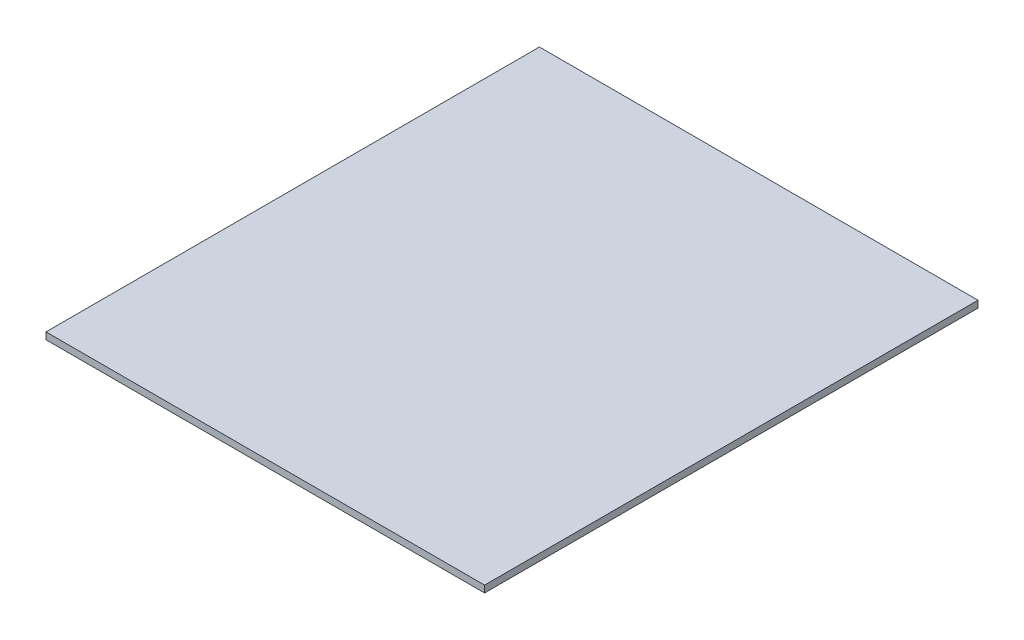
ISO-10303-21;
HEADER;
FILE_DESCRIPTION(('STEP AP214'),'2;1');
FILE_NAME('part.step','',(''),(''),'','','');
FILE_SCHEMA(('AUTOMOTIVE_DESIGN { 1 0 10303 214 1 1 1 1 }'));
ENDSEC;
DATA;
#1=APPLICATION_CONTEXT('core data for automotive mechanical design processes');
#2=APPLICATION_PROTOCOL_DEFINITION('international standard','automotive_design',2000,#1);
#3=PRODUCT_CONTEXT('',#1,'mechanical');
#4=PRODUCT('Part','Part','',(#3));
#5=PRODUCT_RELATED_PRODUCT_CATEGORY('part','',(#4));
#6=PRODUCT_DEFINITION_FORMATION('','',#4);
#7=PRODUCT_DEFINITION_CONTEXT('part definition',#1,'design');
#8=PRODUCT_DEFINITION('design','',#6,#7);
#9=PRODUCT_DEFINITION_SHAPE('','',#8);
#10=(LENGTH_UNIT() NAMED_UNIT(*) SI_UNIT(.MILLI.,.METRE.));
#11=(NAMED_UNIT(*) PLANE_ANGLE_UNIT() SI_UNIT($,.RADIAN.));
#12=(NAMED_UNIT(*) SI_UNIT($,.STERADIAN.) SOLID_ANGLE_UNIT());
#13=UNCERTAINTY_MEASURE_WITH_UNIT(LENGTH_MEASURE(1.E-05),#10,'distance_accuracy_value','');
#14=(GEOMETRIC_REPRESENTATION_CONTEXT(3) GLOBAL_UNCERTAINTY_ASSIGNED_CONTEXT((#13)) GLOBAL_UNIT_ASSIGNED_CONTEXT((#10,
#11,#12)) REPRESENTATION_CONTEXT('',''));
#15=CARTESIAN_POINT('',(0.,0.,0.));
#16=DIRECTION('',(0.,0.,1.));
#17=DIRECTION('',(1.,0.,0.));
#18=AXIS2_PLACEMENT_3D('',#15,#16,#17);
#19=CARTESIAN_POINT('',(203.2,6.35,228.6));
#20=DIRECTION('',(-1.,0.,0.));
#21=DIRECTION('',(0.,0.,1.));
#22=AXIS2_PLACEMENT_3D('',#19,#20,#21);
#23=PLANE('',#22);
#24=DIRECTION('',(0.,0.,-1.));
#25=VECTOR('',#24,1.);
#26=CARTESIAN_POINT('',(203.2,0.,228.6));
#27=LINE('',#26,#25);
#28=CARTESIAN_POINT('',(203.2,0.,228.6));
#29=VERTEX_POINT('',#28);
#30=CARTESIAN_POINT('',(203.2,0.,-228.6));
#31=VERTEX_POINT('',#30);
#32=EDGE_CURVE('E105',#29,#31,#27,.T.);
#33=ORIENTED_EDGE('',*,*,#32,.T.);
#34=DIRECTION('',(0.,-1.,0.));
#35=VECTOR('',#34,1.);
#36=CARTESIAN_POINT('',(203.2,6.35,-228.6));
#37=LINE('',#36,#35);
#38=CARTESIAN_POINT('',(203.2,6.35,-228.6));
#39=VERTEX_POINT('',#38);
#40=EDGE_CURVE('E11',#39,#31,#37,.T.);
#41=ORIENTED_EDGE('',*,*,#40,.F.);
#42=DIRECTION('',(0.,0.,-1.));
#43=VECTOR('',#42,1.);
#44=CARTESIAN_POINT('',(203.2,6.35,228.6));
#45=LINE('',#44,#43);
#46=CARTESIAN_POINT('',(203.2,6.35,228.6));
#47=VERTEX_POINT('',#46);
#48=EDGE_CURVE('E89',#47,#39,#45,.T.);
#49=ORIENTED_EDGE('',*,*,#48,.F.);
#50=DIRECTION('',(0.,-1.,0.));
#51=VECTOR('',#50,1.);
#52=CARTESIAN_POINT('',(203.2,6.35,228.6));
#53=LINE('',#52,#51);
#54=EDGE_CURVE('E98',#47,#29,#53,.T.);
#55=ORIENTED_EDGE('',*,*,#54,.T.);
#56=EDGE_LOOP('',(#33,#41,#49,#55));
#57=FACE_BOUND('',#56,.T.);
#58=ADVANCED_FACE('F39',(#57),#23,.F.);
#59=CARTESIAN_POINT('',(-203.2,6.35,-228.6));
#60=DIRECTION('',(0.,0.,1.));
#61=DIRECTION('',(1.,0.,0.));
#62=AXIS2_PLACEMENT_3D('',#59,#60,#61);
#63=PLANE('',#62);
#64=DIRECTION('',(-1.,0.,0.));
#65=VECTOR('',#64,1.);
#66=CARTESIAN_POINT('',(-203.2,0.,-228.6));
#67=LINE('',#66,#65);
#68=CARTESIAN_POINT('',(-203.2,0.,-228.6));
#69=VERTEX_POINT('',#68);
#70=EDGE_CURVE('E94',#31,#69,#67,.T.);
#71=ORIENTED_EDGE('',*,*,#70,.T.);
#72=DIRECTION('',(0.,-1.,0.));
#73=VECTOR('',#72,1.);
#74=CARTESIAN_POINT('',(-203.2,6.35,-228.6));
#75=LINE('',#74,#73);
#76=CARTESIAN_POINT('',(-203.2,6.35,-228.6));
#77=VERTEX_POINT('',#76);
#78=EDGE_CURVE('E50',#77,#69,#75,.T.);
#79=ORIENTED_EDGE('',*,*,#78,.F.);
#80=DIRECTION('',(-1.,0.,0.));
#81=VECTOR('',#80,1.);
#82=CARTESIAN_POINT('',(-203.2,6.35,-228.6));
#83=LINE('',#82,#81);
#84=EDGE_CURVE('E84',#39,#77,#83,.T.);
#85=ORIENTED_EDGE('',*,*,#84,.F.);
#86=ORIENTED_EDGE('',*,*,#40,.T.);
#87=EDGE_LOOP('',(#71,#79,#85,#86));
#88=FACE_BOUND('',#87,.T.);
#89=ADVANCED_FACE('F91',(#88),#63,.F.);
#90=CARTESIAN_POINT('',(-203.2,6.35,228.6));
#91=DIRECTION('',(1.,0.,0.));
#92=DIRECTION('',(0.,0.,-1.));
#93=AXIS2_PLACEMENT_3D('',#90,#91,#92);
#94=PLANE('',#93);
#95=DIRECTION('',(0.,0.,1.));
#96=VECTOR('',#95,1.);
#97=CARTESIAN_POINT('',(-203.2,0.,228.6));
#98=LINE('',#97,#96);
#99=CARTESIAN_POINT('',(-203.2,0.,228.6));
#100=VERTEX_POINT('',#99);
#101=EDGE_CURVE('E75',#69,#100,#98,.T.);
#102=ORIENTED_EDGE('',*,*,#101,.T.);
#103=DIRECTION('',(0.,-1.,0.));
#104=VECTOR('',#103,1.);
#105=CARTESIAN_POINT('',(-203.2,6.35,228.6));
#106=LINE('',#105,#104);
#107=CARTESIAN_POINT('',(-203.2,6.35,228.6));
#108=VERTEX_POINT('',#107);
#109=EDGE_CURVE('E92',#108,#100,#106,.T.);
#110=ORIENTED_EDGE('',*,*,#109,.F.);
#111=DIRECTION('',(0.,0.,1.));
#112=VECTOR('',#111,1.);
#113=CARTESIAN_POINT('',(-203.2,6.35,228.6));
#114=LINE('',#113,#112);
#115=EDGE_CURVE('E86',#77,#108,#114,.T.);
#116=ORIENTED_EDGE('',*,*,#115,.F.);
#117=ORIENTED_EDGE('',*,*,#78,.T.);
#118=EDGE_LOOP('',(#102,#110,#116,#117));
#119=FACE_BOUND('',#118,.T.);
#120=ADVANCED_FACE('F96',(#119),#94,.F.);
#121=CARTESIAN_POINT('',(-203.2,6.35,228.6));
#122=DIRECTION('',(0.,0.,-1.));
#123=DIRECTION('',(-1.,0.,0.));
#124=AXIS2_PLACEMENT_3D('',#121,#122,#123);
#125=PLANE('',#124);
#126=DIRECTION('',(1.,0.,0.));
#127=VECTOR('',#126,1.);
#128=CARTESIAN_POINT('',(-203.2,0.,228.6));
#129=LINE('',#128,#127);
#130=EDGE_CURVE('E79',#100,#29,#129,.T.);
#131=ORIENTED_EDGE('',*,*,#130,.T.);
#132=ORIENTED_EDGE('',*,*,#54,.F.);
#133=DIRECTION('',(1.,0.,0.));
#134=VECTOR('',#133,1.);
#135=CARTESIAN_POINT('',(-203.2,6.35,228.6));
#136=LINE('',#135,#134);
#137=EDGE_CURVE('E54',#108,#47,#136,.T.);
#138=ORIENTED_EDGE('',*,*,#137,.F.);
#139=ORIENTED_EDGE('',*,*,#109,.T.);
#140=EDGE_LOOP('',(#131,#132,#138,#139));
#141=FACE_BOUND('',#140,.T.);
#142=ADVANCED_FACE('F108',(#141),#125,.F.);
#143=CARTESIAN_POINT('',(0.,6.35,0.));
#144=DIRECTION('',(0.,-1.,0.));
#145=DIRECTION('',(0.,0.,-1.));
#146=AXIS2_PLACEMENT_3D('',#143,#144,#145);
#147=PLANE('',#146);
#148=ORIENTED_EDGE('',*,*,#48,.T.);
#149=ORIENTED_EDGE('',*,*,#84,.T.);
#150=ORIENTED_EDGE('',*,*,#115,.T.);
#151=ORIENTED_EDGE('',*,*,#137,.T.);
#152=EDGE_LOOP('',(#148,#149,#150,#151));
#153=FACE_BOUND('',#152,.T.);
#154=ADVANCED_FACE('F88',(#153),#147,.F.);
#155=CARTESIAN_POINT('',(0.,0.,0.));
#156=DIRECTION('',(0.,-1.,0.));
#157=DIRECTION('',(0.,0.,-1.));
#158=AXIS2_PLACEMENT_3D('',#155,#156,#157);
#159=PLANE('',#158);
#160=ORIENTED_EDGE('',*,*,#32,.F.);
#161=ORIENTED_EDGE('',*,*,#130,.F.);
#162=ORIENTED_EDGE('',*,*,#101,.F.);
#163=ORIENTED_EDGE('',*,*,#70,.F.);
#164=EDGE_LOOP('',(#160,#161,#162,#163));
#165=FACE_BOUND('',#164,.T.);
#166=ADVANCED_FACE('F115',(#165),#159,.T.);
#167=CLOSED_SHELL('',(#58,#89,#120,#142,#154,#166));
#168=MANIFOLD_SOLID_BREP('B2',#167);
#169=ADVANCED_BREP_SHAPE_REPRESENTATION('',(#18,#168),#14);
#170=SHAPE_DEFINITION_REPRESENTATION(#9,#169);
ENDSEC;
END-ISO-10303-21;
